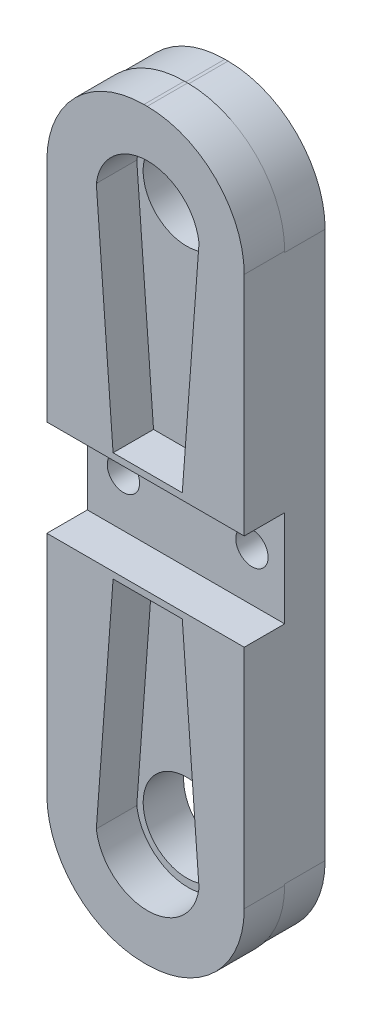
ISO-10303-21;
HEADER;
FILE_DESCRIPTION(('STEP AP214'),'2;1');
FILE_NAME('part.step','',(''),(''),'','','');
FILE_SCHEMA(('AUTOMOTIVE_DESIGN { 1 0 10303 214 1 1 1 1 }'));
ENDSEC;
DATA;
#1=APPLICATION_CONTEXT('core data for automotive mechanical design processes');
#2=APPLICATION_PROTOCOL_DEFINITION('international standard','automotive_design',2000,#1);
#3=PRODUCT_CONTEXT('',#1,'mechanical');
#4=PRODUCT('Part','Part','',(#3));
#5=PRODUCT_RELATED_PRODUCT_CATEGORY('part','',(#4));
#6=PRODUCT_DEFINITION_FORMATION('','',#4);
#7=PRODUCT_DEFINITION_CONTEXT('part definition',#1,'design');
#8=PRODUCT_DEFINITION('design','',#6,#7);
#9=PRODUCT_DEFINITION_SHAPE('','',#8);
#10=(LENGTH_UNIT() NAMED_UNIT(*) SI_UNIT(.MILLI.,.METRE.));
#11=(NAMED_UNIT(*) PLANE_ANGLE_UNIT() SI_UNIT($,.RADIAN.));
#12=(NAMED_UNIT(*) SI_UNIT($,.STERADIAN.) SOLID_ANGLE_UNIT());
#13=UNCERTAINTY_MEASURE_WITH_UNIT(LENGTH_MEASURE(1.E-05),#10,'distance_accuracy_value','');
#14=(GEOMETRIC_REPRESENTATION_CONTEXT(3) GLOBAL_UNCERTAINTY_ASSIGNED_CONTEXT((#13)) GLOBAL_UNIT_ASSIGNED_CONTEXT((#10,
#11,#12)) REPRESENTATION_CONTEXT('',''));
#15=CARTESIAN_POINT('',(0.,0.,0.));
#16=DIRECTION('',(0.,0.,1.));
#17=DIRECTION('',(1.,0.,0.));
#18=AXIS2_PLACEMENT_3D('',#15,#16,#17);
#19=CARTESIAN_POINT('',(0.,0.,12.5));
#20=DIRECTION('',(0.,0.,1.));
#21=DIRECTION('',(1.,0.,0.));
#22=AXIS2_PLACEMENT_3D('',#19,#20,#21);
#23=PLANE('',#22);
#24=CARTESIAN_POINT('',(-185.999682024194,160.057912714201,12.5));
#25=DIRECTION('',(0.,0.,1.));
#26=DIRECTION('',(1.,0.,0.));
#27=AXIS2_PLACEMENT_3D('',#24,#25,#26);
#28=CIRCLE('',#27,1.00000000000002);
#29=CARTESIAN_POINT('',(-184.999682024194,160.057912714201,12.5));
#30=VERTEX_POINT('',#29);
#31=EDGE_CURVE('E326',#30,#30,#28,.T.);
#32=ORIENTED_EDGE('',*,*,#31,.F.);
#33=EDGE_LOOP('',(#32));
#34=FACE_BOUND('',#33,.T.);
#35=CARTESIAN_POINT('',(-178.054871455837,160.057912714201,12.5));
#36=DIRECTION('',(0.,0.,1.));
#37=DIRECTION('',(1.,0.,0.));
#38=AXIS2_PLACEMENT_3D('',#35,#36,#37);
#39=CIRCLE('',#38,0.999999999999998);
#40=CARTESIAN_POINT('',(-177.054871455837,160.057912714201,12.5));
#41=VERTEX_POINT('',#40);
#42=EDGE_CURVE('E273',#41,#41,#39,.T.);
#43=ORIENTED_EDGE('',*,*,#42,.F.);
#44=EDGE_LOOP('',(#43));
#45=FACE_BOUND('',#44,.T.);
#46=DIRECTION('',(0.,-1.,0.));
#47=VECTOR('',#46,1.);
#48=CARTESIAN_POINT('',(-188.231179690793,182.888166790523,12.5));
#49=LINE('',#48,#47);
#50=CARTESIAN_POINT('',(-188.231179690793,162.965455297448,12.5));
#51=VERTEX_POINT('',#50);
#52=CARTESIAN_POINT('',(-188.231179690793,157.010878283599,12.5));
#53=VERTEX_POINT('',#52);
#54=EDGE_CURVE('E411',#51,#53,#49,.T.);
#55=ORIENTED_EDGE('',*,*,#54,.T.);
#56=DIRECTION('',(-1.,0.,0.));
#57=VECTOR('',#56,1.);
#58=CARTESIAN_POINT('',(-176.031179690793,157.010878283599,12.5));
#59=LINE('',#58,#57);
#60=CARTESIAN_POINT('',(-176.031179690793,157.010878283599,12.5));
#61=VERTEX_POINT('',#60);
#62=EDGE_CURVE('E355',#61,#53,#59,.T.);
#63=ORIENTED_EDGE('',*,*,#62,.F.);
#64=DIRECTION('',(0.,1.,0.));
#65=VECTOR('',#64,1.);
#66=CARTESIAN_POINT('',(-176.031179690793,182.888166790523,12.5));
#67=LINE('',#66,#65);
#68=CARTESIAN_POINT('',(-176.031179690793,162.965455297448,12.5));
#69=VERTEX_POINT('',#68);
#70=EDGE_CURVE('E419',#61,#69,#67,.T.);
#71=ORIENTED_EDGE('',*,*,#70,.T.);
#72=DIRECTION('',(1.,0.,0.));
#73=VECTOR('',#72,1.);
#74=CARTESIAN_POINT('',(-176.031179690793,162.965455297448,12.5));
#75=LINE('',#74,#73);
#76=EDGE_CURVE('E379',#51,#69,#75,.T.);
#77=ORIENTED_EDGE('',*,*,#76,.F.);
#78=EDGE_LOOP('',(#55,#63,#71,#77));
#79=FACE_BOUND('',#78,.T.);
#80=ADVANCED_FACE('F39',(#34,#45,#79),#23,.T.);
#81=CARTESIAN_POINT('',(-188.231179690793,182.888166790523,12.5));
#82=DIRECTION('',(1.,0.,0.));
#83=DIRECTION('',(0.,0.,-1.));
#84=AXIS2_PLACEMENT_3D('',#81,#82,#83);
#85=PLANE('',#84);
#86=DIRECTION('',(0.,-1.,0.));
#87=VECTOR('',#86,1.);
#88=CARTESIAN_POINT('',(-188.231179690793,157.010878283599,12.5));
#89=LINE('',#88,#87);
#90=CARTESIAN_POINT('',(-188.231179690793,143.088166790523,12.5));
#91=VERTEX_POINT('',#90);
#92=CARTESIAN_POINT('',(-188.231179690793,143.010878283599,12.5));
#93=VERTEX_POINT('',#92);
#94=EDGE_CURVE('E359',#91,#93,#89,.T.);
#95=ORIENTED_EDGE('',*,*,#94,.T.);
#96=DIRECTION('',(0.,0.,-1.));
#97=VECTOR('',#96,1.);
#98=CARTESIAN_POINT('',(-188.231179690793,143.010878283599,12.5));
#99=LINE('',#98,#97);
#100=CARTESIAN_POINT('',(-188.231179690793,143.010878283599,15.));
#101=VERTEX_POINT('',#100);
#102=EDGE_CURVE('E513',#93,#101,#99,.F.);
#103=ORIENTED_EDGE('',*,*,#102,.T.);
#104=DIRECTION('',(0.,-1.,0.));
#105=VECTOR('',#104,1.);
#106=CARTESIAN_POINT('',(-188.231179690793,157.010878283599,15.));
#107=LINE('',#106,#105);
#108=CARTESIAN_POINT('',(-188.231179690793,157.010878283599,15.));
#109=VERTEX_POINT('',#108);
#110=EDGE_CURVE('E344',#109,#101,#107,.T.);
#111=ORIENTED_EDGE('',*,*,#110,.F.);
#112=DIRECTION('',(0.,0.,-1.));
#113=VECTOR('',#112,1.);
#114=CARTESIAN_POINT('',(-188.231179690793,157.010878283599,15.));
#115=LINE('',#114,#113);
#116=EDGE_CURVE('E352',#109,#53,#115,.T.);
#117=ORIENTED_EDGE('',*,*,#116,.T.);
#118=ORIENTED_EDGE('',*,*,#54,.F.);
#119=DIRECTION('',(0.,0.,-1.));
#120=VECTOR('',#119,1.);
#121=CARTESIAN_POINT('',(-188.231179690793,162.965455297448,15.));
#122=LINE('',#121,#120);
#123=CARTESIAN_POINT('',(-188.231179690793,162.965455297448,15.));
#124=VERTEX_POINT('',#123);
#125=EDGE_CURVE('E406',#124,#51,#122,.T.);
#126=ORIENTED_EDGE('',*,*,#125,.F.);
#127=DIRECTION('',(0.,-1.,0.));
#128=VECTOR('',#127,1.);
#129=CARTESIAN_POINT('',(-188.231179690793,162.965455297448,15.));
#130=LINE('',#129,#128);
#131=CARTESIAN_POINT('',(-188.231179690793,176.965455297448,15.));
#132=VERTEX_POINT('',#131);
#133=EDGE_CURVE('E383',#132,#124,#130,.T.);
#134=ORIENTED_EDGE('',*,*,#133,.F.);
#135=DIRECTION('',(0.,0.,-1.));
#136=VECTOR('',#135,1.);
#137=CARTESIAN_POINT('',(-188.231179690793,176.965455297448,12.5));
#138=LINE('',#137,#136);
#139=CARTESIAN_POINT('',(-188.231179690793,176.965455297448,12.5));
#140=VERTEX_POINT('',#139);
#141=EDGE_CURVE('E509',#132,#140,#138,.T.);
#142=ORIENTED_EDGE('',*,*,#141,.T.);
#143=DIRECTION('',(0.,-1.,0.));
#144=VECTOR('',#143,1.);
#145=CARTESIAN_POINT('',(-188.231179690793,162.965455297448,12.5));
#146=LINE('',#145,#144);
#147=CARTESIAN_POINT('',(-188.231179690793,176.888166790523,12.5));
#148=VERTEX_POINT('',#147);
#149=EDGE_CURVE('E397',#140,#148,#146,.T.);
#150=ORIENTED_EDGE('',*,*,#149,.T.);
#151=DIRECTION('',(0.,0.,-1.));
#152=VECTOR('',#151,1.);
#153=CARTESIAN_POINT('',(-188.231179690793,176.888166790523,12.5));
#154=LINE('',#153,#152);
#155=CARTESIAN_POINT('',(-188.231179690793,176.888166790523,10.));
#156=VERTEX_POINT('',#155);
#157=EDGE_CURVE('E482',#148,#156,#154,.T.);
#158=ORIENTED_EDGE('',*,*,#157,.T.);
#159=DIRECTION('',(0.,-1.,0.));
#160=VECTOR('',#159,1.);
#161=CARTESIAN_POINT('',(-188.231179690793,182.888166790523,10.));
#162=LINE('',#161,#160);
#163=CARTESIAN_POINT('',(-188.231179690793,143.088166790523,10.));
#164=VERTEX_POINT('',#163);
#165=EDGE_CURVE('E410',#156,#164,#162,.T.);
#166=ORIENTED_EDGE('',*,*,#165,.T.);
#167=DIRECTION('',(0.,0.,-1.));
#168=VECTOR('',#167,1.);
#169=CARTESIAN_POINT('',(-188.231179690793,143.088166790523,12.5));
#170=LINE('',#169,#168);
#171=EDGE_CURVE('E486',#164,#91,#170,.F.);
#172=ORIENTED_EDGE('',*,*,#171,.T.);
#173=EDGE_LOOP('',(#95,#103,#111,#117,#118,#126,#134,#142,#150,#158,#166,#172));
#174=FACE_BOUND('',#173,.T.);
#175=ADVANCED_FACE('F578',(#174),#85,.F.);
#176=CARTESIAN_POINT('',(-188.231179690793,137.088166790523,12.5));
#177=DIRECTION('',(0.,1.,0.));
#178=DIRECTION('',(0.,0.,1.));
#179=AXIS2_PLACEMENT_3D('',#176,#177,#178);
#180=PLANE('',#179);
#181=DIRECTION('',(1.,0.,0.));
#182=VECTOR('',#181,1.);
#183=CARTESIAN_POINT('',(-188.231179690793,137.088166790523,10.));
#184=LINE('',#183,#182);
#185=CARTESIAN_POINT('',(-182.231179690793,137.088166790523,10.));
#186=VERTEX_POINT('',#185);
#187=CARTESIAN_POINT('',(-182.031179690793,137.088166790523,10.));
#188=VERTEX_POINT('',#187);
#189=EDGE_CURVE('E430',#186,#188,#184,.T.);
#190=ORIENTED_EDGE('',*,*,#189,.T.);
#191=DIRECTION('',(0.,0.,-1.));
#192=VECTOR('',#191,1.);
#193=CARTESIAN_POINT('',(-182.031179690793,137.088166790523,12.5));
#194=LINE('',#193,#192);
#195=CARTESIAN_POINT('',(-182.031179690793,137.088166790523,12.5));
#196=VERTEX_POINT('',#195);
#197=EDGE_CURVE('E463',#188,#196,#194,.F.);
#198=ORIENTED_EDGE('',*,*,#197,.T.);
#199=DIRECTION('',(1.,0.,0.));
#200=VECTOR('',#199,1.);
#201=CARTESIAN_POINT('',(-188.231179690793,137.088166790523,12.5));
#202=LINE('',#201,#200);
#203=CARTESIAN_POINT('',(-182.231179690793,137.088166790523,12.5));
#204=VERTEX_POINT('',#203);
#205=EDGE_CURVE('E414',#204,#196,#202,.T.);
#206=ORIENTED_EDGE('',*,*,#205,.F.);
#207=DIRECTION('',(0.,0.,-1.));
#208=VECTOR('',#207,1.);
#209=CARTESIAN_POINT('',(-182.231179690793,137.088166790523,12.5));
#210=LINE('',#209,#208);
#211=EDGE_CURVE('E459',#204,#186,#210,.T.);
#212=ORIENTED_EDGE('',*,*,#211,.T.);
#213=EDGE_LOOP('',(#190,#198,#206,#212));
#214=FACE_BOUND('',#213,.T.);
#215=ADVANCED_FACE('F588',(#214),#180,.F.);
#216=CARTESIAN_POINT('',(-176.031179690793,182.888166790523,12.5));
#217=DIRECTION('',(-1.,0.,0.));
#218=DIRECTION('',(0.,0.,1.));
#219=AXIS2_PLACEMENT_3D('',#216,#217,#218);
#220=PLANE('',#219);
#221=DIRECTION('',(0.,1.,0.));
#222=VECTOR('',#221,1.);
#223=CARTESIAN_POINT('',(-176.031179690793,157.010878283599,15.));
#224=LINE('',#223,#222);
#225=CARTESIAN_POINT('',(-176.031179690793,143.010878283599,15.));
#226=VERTEX_POINT('',#225);
#227=CARTESIAN_POINT('',(-176.031179690793,157.010878283599,15.));
#228=VERTEX_POINT('',#227);
#229=EDGE_CURVE('E337',#226,#228,#224,.T.);
#230=ORIENTED_EDGE('',*,*,#229,.F.);
#231=DIRECTION('',(0.,0.,-1.));
#232=VECTOR('',#231,1.);
#233=CARTESIAN_POINT('',(-176.031179690793,143.010878283599,12.5));
#234=LINE('',#233,#232);
#235=CARTESIAN_POINT('',(-176.031179690793,143.010878283599,12.5));
#236=VERTEX_POINT('',#235);
#237=EDGE_CURVE('E525',#226,#236,#234,.T.);
#238=ORIENTED_EDGE('',*,*,#237,.T.);
#239=DIRECTION('',(0.,1.,0.));
#240=VECTOR('',#239,1.);
#241=CARTESIAN_POINT('',(-176.031179690793,157.010878283599,12.5));
#242=LINE('',#241,#240);
#243=CARTESIAN_POINT('',(-176.031179690793,143.088166790523,12.5));
#244=VERTEX_POINT('',#243);
#245=EDGE_CURVE('E325',#236,#244,#242,.T.);
#246=ORIENTED_EDGE('',*,*,#245,.T.);
#247=DIRECTION('',(0.,0.,-1.));
#248=VECTOR('',#247,1.);
#249=CARTESIAN_POINT('',(-176.031179690793,143.088166790523,12.5));
#250=LINE('',#249,#248);
#251=CARTESIAN_POINT('',(-176.031179690793,143.088166790523,10.));
#252=VERTEX_POINT('',#251);
#253=EDGE_CURVE('E443',#244,#252,#250,.T.);
#254=ORIENTED_EDGE('',*,*,#253,.T.);
#255=DIRECTION('',(0.,1.,0.));
#256=VECTOR('',#255,1.);
#257=CARTESIAN_POINT('',(-176.031179690793,182.888166790523,10.));
#258=LINE('',#257,#256);
#259=CARTESIAN_POINT('',(-176.031179690793,176.888166790523,10.));
#260=VERTEX_POINT('',#259);
#261=EDGE_CURVE('E434',#252,#260,#258,.T.);
#262=ORIENTED_EDGE('',*,*,#261,.T.);
#263=DIRECTION('',(0.,0.,-1.));
#264=VECTOR('',#263,1.);
#265=CARTESIAN_POINT('',(-176.031179690793,176.888166790523,12.5));
#266=LINE('',#265,#264);
#267=CARTESIAN_POINT('',(-176.031179690793,176.888166790523,12.5));
#268=VERTEX_POINT('',#267);
#269=EDGE_CURVE('E426',#260,#268,#266,.F.);
#270=ORIENTED_EDGE('',*,*,#269,.T.);
#271=DIRECTION('',(0.,1.,0.));
#272=VECTOR('',#271,1.);
#273=CARTESIAN_POINT('',(-176.031179690793,162.965455297448,12.5));
#274=LINE('',#273,#272);
#275=CARTESIAN_POINT('',(-176.031179690793,176.965455297448,12.5));
#276=VERTEX_POINT('',#275);
#277=EDGE_CURVE('E373',#268,#276,#274,.T.);
#278=ORIENTED_EDGE('',*,*,#277,.T.);
#279=DIRECTION('',(0.,0.,-1.));
#280=VECTOR('',#279,1.);
#281=CARTESIAN_POINT('',(-176.031179690793,176.965455297448,12.5));
#282=LINE('',#281,#280);
#283=CARTESIAN_POINT('',(-176.031179690793,176.965455297448,15.));
#284=VERTEX_POINT('',#283);
#285=EDGE_CURVE('E522',#276,#284,#282,.F.);
#286=ORIENTED_EDGE('',*,*,#285,.T.);
#287=DIRECTION('',(0.,1.,0.));
#288=VECTOR('',#287,1.);
#289=CARTESIAN_POINT('',(-176.031179690793,162.965455297448,15.));
#290=LINE('',#289,#288);
#291=CARTESIAN_POINT('',(-176.031179690793,162.965455297448,15.));
#292=VERTEX_POINT('',#291);
#293=EDGE_CURVE('E374',#292,#284,#290,.T.);
#294=ORIENTED_EDGE('',*,*,#293,.F.);
#295=DIRECTION('',(0.,0.,-1.));
#296=VECTOR('',#295,1.);
#297=CARTESIAN_POINT('',(-176.031179690793,162.965455297448,15.));
#298=LINE('',#297,#296);
#299=EDGE_CURVE('E389',#292,#69,#298,.T.);
#300=ORIENTED_EDGE('',*,*,#299,.T.);
#301=ORIENTED_EDGE('',*,*,#70,.F.);
#302=DIRECTION('',(0.,0.,-1.));
#303=VECTOR('',#302,1.);
#304=CARTESIAN_POINT('',(-176.031179690793,157.010878283599,15.));
#305=LINE('',#304,#303);
#306=EDGE_CURVE('E369',#228,#61,#305,.T.);
#307=ORIENTED_EDGE('',*,*,#306,.F.);
#308=EDGE_LOOP('',(#230,#238,#246,#254,#262,#270,#278,#286,#294,#300,#301,#307));
#309=FACE_BOUND('',#308,.T.);
#310=ADVANCED_FACE('F561',(#309),#220,.F.);
#311=CARTESIAN_POINT('',(-188.231179690793,182.888166790523,12.5));
#312=DIRECTION('',(0.,-1.,0.));
#313=DIRECTION('',(0.,0.,-1.));
#314=AXIS2_PLACEMENT_3D('',#311,#312,#313);
#315=PLANE('',#314);
#316=DIRECTION('',(-1.,0.,0.));
#317=VECTOR('',#316,1.);
#318=CARTESIAN_POINT('',(-188.231179690793,182.888166790523,12.5));
#319=LINE('',#318,#317);
#320=CARTESIAN_POINT('',(-182.031179690793,182.888166790523,12.5));
#321=VERTEX_POINT('',#320);
#322=CARTESIAN_POINT('',(-182.231179690793,182.888166790523,12.5));
#323=VERTEX_POINT('',#322);
#324=EDGE_CURVE('E422',#321,#323,#319,.T.);
#325=ORIENTED_EDGE('',*,*,#324,.F.);
#326=DIRECTION('',(0.,0.,-1.));
#327=VECTOR('',#326,1.);
#328=CARTESIAN_POINT('',(-182.031179690793,182.888166790523,12.5));
#329=LINE('',#328,#327);
#330=CARTESIAN_POINT('',(-182.031179690793,182.888166790523,10.));
#331=VERTEX_POINT('',#330);
#332=EDGE_CURVE('E492',#321,#331,#329,.T.);
#333=ORIENTED_EDGE('',*,*,#332,.T.);
#334=DIRECTION('',(-1.,0.,0.));
#335=VECTOR('',#334,1.);
#336=CARTESIAN_POINT('',(-188.231179690793,182.888166790523,10.));
#337=LINE('',#336,#335);
#338=CARTESIAN_POINT('',(-182.231179690793,182.888166790523,10.));
#339=VERTEX_POINT('',#338);
#340=EDGE_CURVE('E415',#331,#339,#337,.T.);
#341=ORIENTED_EDGE('',*,*,#340,.T.);
#342=DIRECTION('',(0.,0.,-1.));
#343=VECTOR('',#342,1.);
#344=CARTESIAN_POINT('',(-182.231179690793,182.888166790523,12.5));
#345=LINE('',#344,#343);
#346=EDGE_CURVE('E489',#339,#323,#345,.F.);
#347=ORIENTED_EDGE('',*,*,#346,.T.);
#348=EDGE_LOOP('',(#325,#333,#341,#347));
#349=FACE_BOUND('',#348,.T.);
#350=ADVANCED_FACE('F570',(#349),#315,.F.);
#351=CARTESIAN_POINT('',(0.,0.,10.));
#352=DIRECTION('',(0.,0.,1.));
#353=DIRECTION('',(1.,0.,0.));
#354=AXIS2_PLACEMENT_3D('',#351,#352,#353);
#355=PLANE('',#354);
#356=CARTESIAN_POINT('',(-182.080577921619,176.900168290309,10.));
#357=DIRECTION('',(0.,0.,1.));
#358=DIRECTION('',(1.,0.,0.));
#359=AXIS2_PLACEMENT_3D('',#356,#357,#358);
#360=CIRCLE('',#359,2.70000000000001);
#361=CARTESIAN_POINT('',(-179.380577921619,176.900168290309,10.));
#362=VERTEX_POINT('',#361);
#363=EDGE_CURVE('E300',#362,#362,#360,.T.);
#364=ORIENTED_EDGE('',*,*,#363,.T.);
#365=EDGE_LOOP('',(#364));
#366=FACE_BOUND('',#365,.T.);
#367=CARTESIAN_POINT('',(-182.080577921619,143.076165290738,10.));
#368=DIRECTION('',(0.,0.,1.));
#369=DIRECTION('',(-1.,0.,0.));
#370=AXIS2_PLACEMENT_3D('',#367,#368,#369);
#371=CIRCLE('',#370,2.70000000000001);
#372=CARTESIAN_POINT('',(-184.780577921619,143.076165290738,10.));
#373=VERTEX_POINT('',#372);
#374=EDGE_CURVE('E955',#373,#373,#371,.T.);
#375=ORIENTED_EDGE('',*,*,#374,.T.);
#376=EDGE_LOOP('',(#375));
#377=FACE_BOUND('',#376,.T.);
#378=CARTESIAN_POINT('',(-185.999682024194,160.057912714201,10.));
#379=DIRECTION('',(0.,0.,1.));
#380=DIRECTION('',(1.,0.,0.));
#381=AXIS2_PLACEMENT_3D('',#378,#379,#380);
#382=CIRCLE('',#381,1.00000000000002);
#383=CARTESIAN_POINT('',(-184.999682024194,160.057912714201,10.));
#384=VERTEX_POINT('',#383);
#385=EDGE_CURVE('E321',#384,#384,#382,.T.);
#386=ORIENTED_EDGE('',*,*,#385,.T.);
#387=EDGE_LOOP('',(#386));
#388=FACE_BOUND('',#387,.T.);
#389=CARTESIAN_POINT('',(-178.054871455837,160.057912714201,10.));
#390=DIRECTION('',(0.,0.,1.));
#391=DIRECTION('',(1.,0.,0.));
#392=AXIS2_PLACEMENT_3D('',#389,#390,#391);
#393=CIRCLE('',#392,0.999999999999998);
#394=CARTESIAN_POINT('',(-177.054871455837,160.057912714201,10.));
#395=VERTEX_POINT('',#394);
#396=EDGE_CURVE('E330',#395,#395,#393,.T.);
#397=ORIENTED_EDGE('',*,*,#396,.T.);
#398=EDGE_LOOP('',(#397));
#399=FACE_BOUND('',#398,.T.);
#400=ORIENTED_EDGE('',*,*,#261,.F.);
#401=CARTESIAN_POINT('',(-182.031179690793,143.088166790523,10.));
#402=DIRECTION('',(0.,0.,1.));
#403=DIRECTION('',(1.,0.,0.));
#404=AXIS2_PLACEMENT_3D('',#401,#402,#403);
#405=CIRCLE('',#404,6.);
#406=EDGE_CURVE('E456',#252,#188,#405,.F.);
#407=ORIENTED_EDGE('',*,*,#406,.T.);
#408=ORIENTED_EDGE('',*,*,#189,.F.);
#409=CARTESIAN_POINT('',(-182.231179690793,143.088166790523,10.));
#410=DIRECTION('',(0.,0.,1.));
#411=DIRECTION('',(1.,0.,0.));
#412=AXIS2_PLACEMENT_3D('',#409,#410,#411);
#413=CIRCLE('',#412,6.);
#414=EDGE_CURVE('E453',#186,#164,#413,.F.);
#415=ORIENTED_EDGE('',*,*,#414,.T.);
#416=ORIENTED_EDGE('',*,*,#165,.F.);
#417=CARTESIAN_POINT('',(-182.231179690793,176.888166790523,10.));
#418=DIRECTION('',(0.,0.,1.));
#419=DIRECTION('',(1.,0.,0.));
#420=AXIS2_PLACEMENT_3D('',#417,#418,#419);
#421=CIRCLE('',#420,6.);
#422=EDGE_CURVE('E447',#156,#339,#421,.F.);
#423=ORIENTED_EDGE('',*,*,#422,.T.);
#424=ORIENTED_EDGE('',*,*,#340,.F.);
#425=CARTESIAN_POINT('',(-182.031179690793,176.888166790523,10.));
#426=DIRECTION('',(0.,0.,1.));
#427=DIRECTION('',(1.,0.,0.));
#428=AXIS2_PLACEMENT_3D('',#425,#426,#427);
#429=CIRCLE('',#428,6.);
#430=EDGE_CURVE('E450',#331,#260,#429,.F.);
#431=ORIENTED_EDGE('',*,*,#430,.T.);
#432=EDGE_LOOP('',(#400,#407,#408,#415,#416,#423,#424,#431));
#433=FACE_BOUND('',#432,.T.);
#434=ADVANCED_FACE('F581',(#366,#377,#388,#399,#433),#355,.F.);
#435=CARTESIAN_POINT('',(-182.031179690793,143.088166790523,12.5));
#436=DIRECTION('',(0.,0.,-1.));
#437=DIRECTION('',(-1.,0.,0.));
#438=AXIS2_PLACEMENT_3D('',#435,#436,#437);
#439=CYLINDRICAL_SURFACE('',#438,6.);
#440=CARTESIAN_POINT('',(-182.031179690793,143.088166790523,12.5));
#441=DIRECTION('',(0.,0.,1.));
#442=DIRECTION('',(1.,0.,0.));
#443=AXIS2_PLACEMENT_3D('',#440,#441,#442);
#444=CIRCLE('',#443,6.);
#445=EDGE_CURVE('E478',#196,#244,#444,.T.);
#446=ORIENTED_EDGE('',*,*,#445,.F.);
#447=ORIENTED_EDGE('',*,*,#197,.F.);
#448=ORIENTED_EDGE('',*,*,#406,.F.);
#449=ORIENTED_EDGE('',*,*,#253,.F.);
#450=EDGE_LOOP('',(#446,#447,#448,#449));
#451=FACE_BOUND('',#450,.T.);
#452=ADVANCED_FACE('F652',(#451),#439,.T.);
#453=CARTESIAN_POINT('',(-182.231179690793,143.088166790523,12.5));
#454=DIRECTION('',(0.,0.,-1.));
#455=DIRECTION('',(-1.,0.,0.));
#456=AXIS2_PLACEMENT_3D('',#453,#454,#455);
#457=CYLINDRICAL_SURFACE('',#456,6.);
#458=CARTESIAN_POINT('',(-182.231179690793,143.088166790523,12.5));
#459=DIRECTION('',(0.,0.,1.));
#460=DIRECTION('',(1.,0.,0.));
#461=AXIS2_PLACEMENT_3D('',#458,#459,#460);
#462=CIRCLE('',#461,6.);
#463=EDGE_CURVE('E474',#91,#204,#462,.T.);
#464=ORIENTED_EDGE('',*,*,#463,.F.);
#465=ORIENTED_EDGE('',*,*,#171,.F.);
#466=ORIENTED_EDGE('',*,*,#414,.F.);
#467=ORIENTED_EDGE('',*,*,#211,.F.);
#468=EDGE_LOOP('',(#464,#465,#466,#467));
#469=FACE_BOUND('',#468,.T.);
#470=ADVANCED_FACE('F585',(#469),#457,.T.);
#471=CARTESIAN_POINT('',(-182.031179690793,176.888166790523,12.5));
#472=DIRECTION('',(0.,0.,-1.));
#473=DIRECTION('',(-1.,0.,0.));
#474=AXIS2_PLACEMENT_3D('',#471,#472,#473);
#475=CYLINDRICAL_SURFACE('',#474,6.);
#476=CARTESIAN_POINT('',(-182.031179690793,176.888166790523,12.5));
#477=DIRECTION('',(0.,0.,1.));
#478=DIRECTION('',(1.,0.,0.));
#479=AXIS2_PLACEMENT_3D('',#476,#477,#478);
#480=CIRCLE('',#479,6.);
#481=EDGE_CURVE('E470',#268,#321,#480,.T.);
#482=ORIENTED_EDGE('',*,*,#481,.F.);
#483=ORIENTED_EDGE('',*,*,#269,.F.);
#484=ORIENTED_EDGE('',*,*,#430,.F.);
#485=ORIENTED_EDGE('',*,*,#332,.F.);
#486=EDGE_LOOP('',(#482,#483,#484,#485));
#487=FACE_BOUND('',#486,.T.);
#488=ADVANCED_FACE('F567',(#487),#475,.T.);
#489=CARTESIAN_POINT('',(-182.231179690793,176.888166790523,12.5));
#490=DIRECTION('',(0.,0.,-1.));
#491=DIRECTION('',(-1.,0.,0.));
#492=AXIS2_PLACEMENT_3D('',#489,#490,#491);
#493=CYLINDRICAL_SURFACE('',#492,6.);
#494=CARTESIAN_POINT('',(-182.231179690793,176.888166790523,12.5));
#495=DIRECTION('',(0.,0.,1.));
#496=DIRECTION('',(1.,0.,0.));
#497=AXIS2_PLACEMENT_3D('',#494,#495,#496);
#498=CIRCLE('',#497,6.);
#499=EDGE_CURVE('E466',#323,#148,#498,.T.);
#500=ORIENTED_EDGE('',*,*,#499,.F.);
#501=ORIENTED_EDGE('',*,*,#346,.F.);
#502=ORIENTED_EDGE('',*,*,#422,.F.);
#503=ORIENTED_EDGE('',*,*,#157,.F.);
#504=EDGE_LOOP('',(#500,#501,#502,#503));
#505=FACE_BOUND('',#504,.T.);
#506=ADVANCED_FACE('F575',(#505),#493,.T.);
#507=CARTESIAN_POINT('',(0.,0.,12.5));
#508=DIRECTION('',(0.,0.,1.));
#509=DIRECTION('',(1.,0.,0.));
#510=AXIS2_PLACEMENT_3D('',#507,#508,#509);
#511=PLANE('',#510);
#512=ORIENTED_EDGE('',*,*,#149,.F.);
#513=CARTESIAN_POINT('',(-182.231179690793,176.965455297448,12.5));
#514=DIRECTION('',(0.,0.,1.));
#515=DIRECTION('',(1.,0.,0.));
#516=AXIS2_PLACEMENT_3D('',#513,#514,#515);
#517=CIRCLE('',#516,6.);
#518=CARTESIAN_POINT('',(-182.231179690793,182.965455297448,12.5));
#519=VERTEX_POINT('',#518);
#520=EDGE_CURVE('E532',#140,#519,#517,.F.);
#521=ORIENTED_EDGE('',*,*,#520,.T.);
#522=DIRECTION('',(-1.,0.,0.));
#523=VECTOR('',#522,1.);
#524=CARTESIAN_POINT('',(-176.031179690793,182.965455297448,12.5));
#525=LINE('',#524,#523);
#526=CARTESIAN_POINT('',(-182.031179690793,182.965455297448,12.5));
#527=VERTEX_POINT('',#526);
#528=EDGE_CURVE('E393',#527,#519,#525,.T.);
#529=ORIENTED_EDGE('',*,*,#528,.F.);
#530=CARTESIAN_POINT('',(-182.031179690793,176.965455297448,12.5));
#531=DIRECTION('',(0.,0.,1.));
#532=DIRECTION('',(1.,0.,0.));
#533=AXIS2_PLACEMENT_3D('',#530,#531,#532);
#534=CIRCLE('',#533,6.);
#535=EDGE_CURVE('E529',#527,#276,#534,.F.);
#536=ORIENTED_EDGE('',*,*,#535,.T.);
#537=ORIENTED_EDGE('',*,*,#277,.F.);
#538=ORIENTED_EDGE('',*,*,#481,.T.);
#539=ORIENTED_EDGE('',*,*,#324,.T.);
#540=ORIENTED_EDGE('',*,*,#499,.T.);
#541=EDGE_LOOP('',(#512,#521,#529,#536,#537,#538,#539,#540));
#542=FACE_BOUND('',#541,.T.);
#543=ADVANCED_FACE('F558',(#542),#511,.F.);
#544=CARTESIAN_POINT('',(-176.031179690793,182.965455297448,15.));
#545=DIRECTION('',(0.,-1.,0.));
#546=DIRECTION('',(0.,0.,-1.));
#547=AXIS2_PLACEMENT_3D('',#544,#545,#546);
#548=PLANE('',#547);
#549=ORIENTED_EDGE('',*,*,#528,.T.);
#550=DIRECTION('',(0.,0.,-1.));
#551=VECTOR('',#550,1.);
#552=CARTESIAN_POINT('',(-182.231179690793,182.965455297448,15.));
#553=LINE('',#552,#551);
#554=CARTESIAN_POINT('',(-182.231179690793,182.965455297448,15.));
#555=VERTEX_POINT('',#554);
#556=EDGE_CURVE('E539',#519,#555,#553,.F.);
#557=ORIENTED_EDGE('',*,*,#556,.T.);
#558=DIRECTION('',(-1.,0.,0.));
#559=VECTOR('',#558,1.);
#560=CARTESIAN_POINT('',(-176.031179690793,182.965455297448,15.));
#561=LINE('',#560,#559);
#562=CARTESIAN_POINT('',(-182.031179690793,182.965455297448,15.));
#563=VERTEX_POINT('',#562);
#564=EDGE_CURVE('E378',#563,#555,#561,.T.);
#565=ORIENTED_EDGE('',*,*,#564,.F.);
#566=DIRECTION('',(0.,0.,-1.));
#567=VECTOR('',#566,1.);
#568=CARTESIAN_POINT('',(-182.031179690793,182.965455297448,15.));
#569=LINE('',#568,#567);
#570=EDGE_CURVE('E535',#563,#527,#569,.T.);
#571=ORIENTED_EDGE('',*,*,#570,.T.);
#572=EDGE_LOOP('',(#549,#557,#565,#571));
#573=FACE_BOUND('',#572,.T.);
#574=ADVANCED_FACE('F552',(#573),#548,.F.);
#575=CARTESIAN_POINT('',(-176.031179690793,162.965455297448,15.));
#576=DIRECTION('',(0.,1.,0.));
#577=DIRECTION('',(0.,0.,1.));
#578=AXIS2_PLACEMENT_3D('',#575,#576,#577);
#579=PLANE('',#578);
#580=ORIENTED_EDGE('',*,*,#76,.T.);
#581=ORIENTED_EDGE('',*,*,#299,.F.);
#582=DIRECTION('',(1.,0.,0.));
#583=VECTOR('',#582,1.);
#584=CARTESIAN_POINT('',(-176.031179690793,162.965455297448,15.));
#585=LINE('',#584,#583);
#586=EDGE_CURVE('E386',#124,#292,#585,.T.);
#587=ORIENTED_EDGE('',*,*,#586,.F.);
#588=ORIENTED_EDGE('',*,*,#125,.T.);
#589=EDGE_LOOP('',(#580,#581,#587,#588));
#590=FACE_BOUND('',#589,.T.);
#591=ADVANCED_FACE('F624',(#590),#579,.F.);
#592=CARTESIAN_POINT('',(0.,0.,15.));
#593=DIRECTION('',(0.,0.,1.));
#594=DIRECTION('',(1.,0.,0.));
#595=AXIS2_PLACEMENT_3D('',#592,#593,#594);
#596=PLANE('',#595);
#597=DIRECTION('',(0.074379950661477,-0.997229974950411,0.));
#598=VECTOR('',#597,1.);
#599=CARTESIAN_POINT('',(-184.138427734375,163.365707397461,15.));
#600=LINE('',#599,#598);
#601=CARTESIAN_POINT('',(-185.175109863281,177.264755249023,15.));
#602=VERTEX_POINT('',#601);
#603=CARTESIAN_POINT('',(-184.138427734375,163.365707397461,15.));
#604=VERTEX_POINT('',#603);
#605=EDGE_CURVE('E55',#602,#604,#600,.T.);
#606=ORIENTED_EDGE('',*,*,#605,.F.);
#607=CARTESIAN_POINT('',(-182.,176.858526491128,15.));
#608=DIRECTION('',(0.,0.,1.));
#609=DIRECTION('',(-1.,0.,0.));
#610=AXIS2_PLACEMENT_3D('',#607,#608,#609);
#611=CIRCLE('',#610,3.2009911664431);
#612=CARTESIAN_POINT('',(-178.824890136719,177.264755249023,15.));
#613=VERTEX_POINT('',#612);
#614=EDGE_CURVE('E247',#613,#602,#611,.T.);
#615=ORIENTED_EDGE('',*,*,#614,.F.);
#616=DIRECTION('',(0.074379950661475,0.997229974950411,0.));
#617=VECTOR('',#616,1.);
#618=CARTESIAN_POINT('',(-179.861572265625,163.365707397461,15.));
#619=LINE('',#618,#617);
#620=CARTESIAN_POINT('',(-179.861572265625,163.365707397461,15.));
#621=VERTEX_POINT('',#620);
#622=EDGE_CURVE('E251',#621,#613,#619,.T.);
#623=ORIENTED_EDGE('',*,*,#622,.F.);
#624=DIRECTION('',(1.,0.,0.));
#625=VECTOR('',#624,1.);
#626=CARTESIAN_POINT('',(-184.138427734375,163.365707397461,15.));
#627=LINE('',#626,#625);
#628=EDGE_CURVE('E263',#604,#621,#627,.T.);
#629=ORIENTED_EDGE('',*,*,#628,.F.);
#630=EDGE_LOOP('',(#606,#615,#623,#629));
#631=FACE_BOUND('',#630,.T.);
#632=ORIENTED_EDGE('',*,*,#564,.T.);
#633=CARTESIAN_POINT('',(-182.231179690793,176.965455297448,15.));
#634=DIRECTION('',(0.,0.,1.));
#635=DIRECTION('',(1.,0.,0.));
#636=AXIS2_PLACEMENT_3D('',#633,#634,#635);
#637=CIRCLE('',#636,6.);
#638=EDGE_CURVE('E11',#555,#132,#637,.T.);
#639=ORIENTED_EDGE('',*,*,#638,.T.);
#640=ORIENTED_EDGE('',*,*,#133,.T.);
#641=ORIENTED_EDGE('',*,*,#586,.T.);
#642=ORIENTED_EDGE('',*,*,#293,.T.);
#643=CARTESIAN_POINT('',(-182.031179690793,176.965455297448,15.));
#644=DIRECTION('',(0.,0.,1.));
#645=DIRECTION('',(1.,0.,0.));
#646=AXIS2_PLACEMENT_3D('',#643,#644,#645);
#647=CIRCLE('',#646,6.);
#648=EDGE_CURVE('E48',#284,#563,#647,.T.);
#649=ORIENTED_EDGE('',*,*,#648,.T.);
#650=EDGE_LOOP('',(#632,#639,#640,#641,#642,#649));
#651=FACE_BOUND('',#650,.T.);
#652=ADVANCED_FACE('F545',(#631,#651),#596,.T.);
#653=CARTESIAN_POINT('',(-176.031179690793,157.010878283599,15.));
#654=DIRECTION('',(0.,-1.,0.));
#655=DIRECTION('',(0.,0.,-1.));
#656=AXIS2_PLACEMENT_3D('',#653,#654,#655);
#657=PLANE('',#656);
#658=ORIENTED_EDGE('',*,*,#62,.T.);
#659=ORIENTED_EDGE('',*,*,#116,.F.);
#660=DIRECTION('',(-1.,0.,0.));
#661=VECTOR('',#660,1.);
#662=CARTESIAN_POINT('',(-176.031179690793,157.010878283599,15.));
#663=LINE('',#662,#661);
#664=EDGE_CURVE('E340',#228,#109,#663,.T.);
#665=ORIENTED_EDGE('',*,*,#664,.F.);
#666=ORIENTED_EDGE('',*,*,#306,.T.);
#667=EDGE_LOOP('',(#658,#659,#665,#666));
#668=FACE_BOUND('',#667,.T.);
#669=ADVANCED_FACE('F616',(#668),#657,.F.);
#670=CARTESIAN_POINT('',(-176.031179690793,137.010878283599,15.));
#671=DIRECTION('',(0.,1.,0.));
#672=DIRECTION('',(0.,0.,1.));
#673=AXIS2_PLACEMENT_3D('',#670,#671,#672);
#674=PLANE('',#673);
#675=DIRECTION('',(1.,0.,0.));
#676=VECTOR('',#675,1.);
#677=CARTESIAN_POINT('',(-176.031179690793,137.010878283599,15.));
#678=LINE('',#677,#676);
#679=CARTESIAN_POINT('',(-182.231179690793,137.010878283599,15.));
#680=VERTEX_POINT('',#679);
#681=CARTESIAN_POINT('',(-182.031179690793,137.010878283599,15.));
#682=VERTEX_POINT('',#681);
#683=EDGE_CURVE('E348',#680,#682,#678,.T.);
#684=ORIENTED_EDGE('',*,*,#683,.F.);
#685=DIRECTION('',(0.,0.,-1.));
#686=VECTOR('',#685,1.);
#687=CARTESIAN_POINT('',(-182.231179690793,137.010878283599,15.));
#688=LINE('',#687,#686);
#689=CARTESIAN_POINT('',(-182.231179690793,137.010878283599,12.5));
#690=VERTEX_POINT('',#689);
#691=EDGE_CURVE('E499',#680,#690,#688,.T.);
#692=ORIENTED_EDGE('',*,*,#691,.T.);
#693=DIRECTION('',(1.,0.,0.));
#694=VECTOR('',#693,1.);
#695=CARTESIAN_POINT('',(-176.031179690793,137.010878283599,12.5));
#696=LINE('',#695,#694);
#697=CARTESIAN_POINT('',(-182.031179690793,137.010878283599,12.5));
#698=VERTEX_POINT('',#697);
#699=EDGE_CURVE('E341',#690,#698,#696,.T.);
#700=ORIENTED_EDGE('',*,*,#699,.T.);
#701=DIRECTION('',(0.,0.,-1.));
#702=VECTOR('',#701,1.);
#703=CARTESIAN_POINT('',(-182.031179690793,137.010878283599,15.));
#704=LINE('',#703,#702);
#705=EDGE_CURVE('E496',#698,#682,#704,.F.);
#706=ORIENTED_EDGE('',*,*,#705,.T.);
#707=EDGE_LOOP('',(#684,#692,#700,#706));
#708=FACE_BOUND('',#707,.T.);
#709=ADVANCED_FACE('F606',(#708),#674,.F.);
#710=CARTESIAN_POINT('',(0.,0.,15.));
#711=DIRECTION('',(0.,0.,-1.));
#712=DIRECTION('',(-1.,0.,0.));
#713=AXIS2_PLACEMENT_3D('',#710,#711,#712);
#714=PLANE('',#713);
#715=DIRECTION('',(-0.074379950661477,-0.997229974950411,0.));
#716=VECTOR('',#715,1.);
#717=CARTESIAN_POINT('',(-184.138427734375,156.610626183586,15.));
#718=LINE('',#717,#716);
#719=CARTESIAN_POINT('',(-184.138427734375,156.610626183586,15.));
#720=VERTEX_POINT('',#719);
#721=CARTESIAN_POINT('',(-185.175109863281,142.711578332023,15.));
#722=VERTEX_POINT('',#721);
#723=EDGE_CURVE('E299',#720,#722,#718,.T.);
#724=ORIENTED_EDGE('',*,*,#723,.F.);
#725=DIRECTION('',(-1.,0.,0.));
#726=VECTOR('',#725,1.);
#727=CARTESIAN_POINT('',(-184.138427734375,156.610626183586,15.));
#728=LINE('',#727,#726);
#729=CARTESIAN_POINT('',(-179.861572265625,156.610626183586,15.));
#730=VERTEX_POINT('',#729);
#731=EDGE_CURVE('E63',#730,#720,#728,.T.);
#732=ORIENTED_EDGE('',*,*,#731,.F.);
#733=DIRECTION('',(-0.074379950661475,0.997229974950411,0.));
#734=VECTOR('',#733,1.);
#735=CARTESIAN_POINT('',(-179.861572265625,156.610626183586,15.));
#736=LINE('',#735,#734);
#737=CARTESIAN_POINT('',(-178.824890136719,142.711578332023,15.));
#738=VERTEX_POINT('',#737);
#739=EDGE_CURVE('E284',#738,#730,#736,.T.);
#740=ORIENTED_EDGE('',*,*,#739,.F.);
#741=CARTESIAN_POINT('',(-182.,143.117807089918,15.));
#742=DIRECTION('',(0.,0.,1.));
#743=DIRECTION('',(1.,0.,0.));
#744=AXIS2_PLACEMENT_3D('',#741,#742,#743);
#745=CIRCLE('',#744,3.2009911664431);
#746=EDGE_CURVE('E304',#722,#738,#745,.T.);
#747=ORIENTED_EDGE('',*,*,#746,.F.);
#748=EDGE_LOOP('',(#724,#732,#740,#747));
#749=FACE_BOUND('',#748,.T.);
#750=ORIENTED_EDGE('',*,*,#110,.T.);
#751=CARTESIAN_POINT('',(-182.231179690793,143.010878283599,15.));
#752=DIRECTION('',(0.,0.,-1.));
#753=DIRECTION('',(-1.,0.,0.));
#754=AXIS2_PLACEMENT_3D('',#751,#752,#753);
#755=CIRCLE('',#754,6.);
#756=EDGE_CURVE('E519',#101,#680,#755,.F.);
#757=ORIENTED_EDGE('',*,*,#756,.T.);
#758=ORIENTED_EDGE('',*,*,#683,.T.);
#759=CARTESIAN_POINT('',(-182.031179690793,143.010878283599,15.));
#760=DIRECTION('',(0.,0.,-1.));
#761=DIRECTION('',(-1.,0.,0.));
#762=AXIS2_PLACEMENT_3D('',#759,#760,#761);
#763=CIRCLE('',#762,6.);
#764=EDGE_CURVE('E516',#682,#226,#763,.F.);
#765=ORIENTED_EDGE('',*,*,#764,.T.);
#766=ORIENTED_EDGE('',*,*,#229,.T.);
#767=ORIENTED_EDGE('',*,*,#664,.T.);
#768=EDGE_LOOP('',(#750,#757,#758,#765,#766,#767));
#769=FACE_BOUND('',#768,.T.);
#770=ADVANCED_FACE('F603',(#749,#769),#714,.F.);
#771=CARTESIAN_POINT('',(0.,0.,12.5));
#772=DIRECTION('',(0.,0.,-1.));
#773=DIRECTION('',(-1.,0.,0.));
#774=AXIS2_PLACEMENT_3D('',#771,#772,#773);
#775=PLANE('',#774);
#776=ORIENTED_EDGE('',*,*,#699,.F.);
#777=CARTESIAN_POINT('',(-182.231179690793,143.010878283599,12.5));
#778=DIRECTION('',(0.,0.,-1.));
#779=DIRECTION('',(-1.,0.,0.));
#780=AXIS2_PLACEMENT_3D('',#777,#778,#779);
#781=CIRCLE('',#780,6.);
#782=EDGE_CURVE('E506',#690,#93,#781,.T.);
#783=ORIENTED_EDGE('',*,*,#782,.T.);
#784=ORIENTED_EDGE('',*,*,#94,.F.);
#785=ORIENTED_EDGE('',*,*,#463,.T.);
#786=ORIENTED_EDGE('',*,*,#205,.T.);
#787=ORIENTED_EDGE('',*,*,#445,.T.);
#788=ORIENTED_EDGE('',*,*,#245,.F.);
#789=CARTESIAN_POINT('',(-182.031179690793,143.010878283599,12.5));
#790=DIRECTION('',(0.,0.,-1.));
#791=DIRECTION('',(-1.,0.,0.));
#792=AXIS2_PLACEMENT_3D('',#789,#790,#791);
#793=CIRCLE('',#792,6.);
#794=EDGE_CURVE('E503',#236,#698,#793,.T.);
#795=ORIENTED_EDGE('',*,*,#794,.T.);
#796=EDGE_LOOP('',(#776,#783,#784,#785,#786,#787,#788,#795));
#797=FACE_BOUND('',#796,.T.);
#798=ADVANCED_FACE('F594',(#797),#775,.T.);
#799=CARTESIAN_POINT('',(-182.231179690793,143.010878283599,15.));
#800=DIRECTION('',(0.,0.,-1.));
#801=DIRECTION('',(-1.,0.,0.));
#802=AXIS2_PLACEMENT_3D('',#799,#800,#801);
#803=CYLINDRICAL_SURFACE('',#802,6.);
#804=ORIENTED_EDGE('',*,*,#756,.F.);
#805=ORIENTED_EDGE('',*,*,#102,.F.);
#806=ORIENTED_EDGE('',*,*,#782,.F.);
#807=ORIENTED_EDGE('',*,*,#691,.F.);
#808=EDGE_LOOP('',(#804,#805,#806,#807));
#809=FACE_BOUND('',#808,.T.);
#810=ADVANCED_FACE('F599',(#809),#803,.T.);
#811=CARTESIAN_POINT('',(-182.031179690793,143.010878283599,12.5));
#812=DIRECTION('',(0.,0.,-1.));
#813=DIRECTION('',(-1.,0.,0.));
#814=AXIS2_PLACEMENT_3D('',#811,#812,#813);
#815=CYLINDRICAL_SURFACE('',#814,6.);
#816=ORIENTED_EDGE('',*,*,#764,.F.);
#817=ORIENTED_EDGE('',*,*,#705,.F.);
#818=ORIENTED_EDGE('',*,*,#794,.F.);
#819=ORIENTED_EDGE('',*,*,#237,.F.);
#820=EDGE_LOOP('',(#816,#817,#818,#819));
#821=FACE_BOUND('',#820,.T.);
#822=ADVANCED_FACE('F609',(#821),#815,.T.);
#823=CARTESIAN_POINT('',(-182.231179690793,176.965455297448,12.5));
#824=DIRECTION('',(0.,0.,-1.));
#825=DIRECTION('',(-1.,0.,0.));
#826=AXIS2_PLACEMENT_3D('',#823,#824,#825);
#827=CYLINDRICAL_SURFACE('',#826,6.);
#828=ORIENTED_EDGE('',*,*,#638,.F.);
#829=ORIENTED_EDGE('',*,*,#556,.F.);
#830=ORIENTED_EDGE('',*,*,#520,.F.);
#831=ORIENTED_EDGE('',*,*,#141,.F.);
#832=EDGE_LOOP('',(#828,#829,#830,#831));
#833=FACE_BOUND('',#832,.T.);
#834=ADVANCED_FACE('F628',(#833),#827,.T.);
#835=CARTESIAN_POINT('',(-182.031179690793,176.965455297448,15.));
#836=DIRECTION('',(0.,0.,-1.));
#837=DIRECTION('',(-1.,0.,0.));
#838=AXIS2_PLACEMENT_3D('',#835,#836,#837);
#839=CYLINDRICAL_SURFACE('',#838,6.);
#840=ORIENTED_EDGE('',*,*,#648,.F.);
#841=ORIENTED_EDGE('',*,*,#285,.F.);
#842=ORIENTED_EDGE('',*,*,#535,.F.);
#843=ORIENTED_EDGE('',*,*,#570,.F.);
#844=EDGE_LOOP('',(#840,#841,#842,#843));
#845=FACE_BOUND('',#844,.T.);
#846=ADVANCED_FACE('F41',(#845),#839,.T.);
#847=CARTESIAN_POINT('',(-178.054871455837,160.057912714201,10.));
#848=DIRECTION('',(0.,0.,1.));
#849=DIRECTION('',(1.,0.,0.));
#850=AXIS2_PLACEMENT_3D('',#847,#848,#849);
#851=CYLINDRICAL_SURFACE('',#850,0.999999999999998);
#852=ORIENTED_EDGE('',*,*,#396,.F.);
#853=EDGE_LOOP('',(#852));
#854=FACE_BOUND('',#853,.T.);
#855=ORIENTED_EDGE('',*,*,#42,.T.);
#856=EDGE_LOOP('',(#855));
#857=FACE_BOUND('',#856,.T.);
#858=ADVANCED_FACE('F634',(#854,#857),#851,.F.);
#859=CARTESIAN_POINT('',(-185.999682024194,160.057912714201,10.));
#860=DIRECTION('',(0.,0.,1.));
#861=DIRECTION('',(1.,0.,0.));
#862=AXIS2_PLACEMENT_3D('',#859,#860,#861);
#863=CYLINDRICAL_SURFACE('',#862,1.00000000000002);
#864=ORIENTED_EDGE('',*,*,#385,.F.);
#865=EDGE_LOOP('',(#864));
#866=FACE_BOUND('',#865,.T.);
#867=ORIENTED_EDGE('',*,*,#31,.T.);
#868=EDGE_LOOP('',(#867));
#869=FACE_BOUND('',#868,.T.);
#870=ADVANCED_FACE('F829',(#866,#869),#863,.F.);
#871=CARTESIAN_POINT('',(-184.138427734375,156.610626183586,12.5));
#872=DIRECTION('',(0.,1.,0.));
#873=DIRECTION('',(0.,0.,1.));
#874=AXIS2_PLACEMENT_3D('',#871,#872,#873);
#875=PLANE('',#874);
#876=ORIENTED_EDGE('',*,*,#731,.T.);
#877=DIRECTION('',(0.,0.,1.));
#878=VECTOR('',#877,1.);
#879=CARTESIAN_POINT('',(-184.138427734375,156.610626183586,12.5));
#880=LINE('',#879,#878);
#881=CARTESIAN_POINT('',(-184.138427734375,156.610626183586,12.5));
#882=VERTEX_POINT('',#881);
#883=EDGE_CURVE('E296',#882,#720,#880,.T.);
#884=ORIENTED_EDGE('',*,*,#883,.F.);
#885=DIRECTION('',(-1.,0.,0.));
#886=VECTOR('',#885,1.);
#887=CARTESIAN_POINT('',(-184.138427734375,156.610626183586,12.5));
#888=LINE('',#887,#886);
#889=CARTESIAN_POINT('',(-179.861572265625,156.610626183586,12.5));
#890=VERTEX_POINT('',#889);
#891=EDGE_CURVE('E279',#890,#882,#888,.T.);
#892=ORIENTED_EDGE('',*,*,#891,.F.);
#893=DIRECTION('',(0.,0.,1.));
#894=VECTOR('',#893,1.);
#895=CARTESIAN_POINT('',(-179.861572265625,156.610626183586,12.5));
#896=LINE('',#895,#894);
#897=EDGE_CURVE('E264',#890,#730,#896,.T.);
#898=ORIENTED_EDGE('',*,*,#897,.T.);
#899=EDGE_LOOP('',(#876,#884,#892,#898));
#900=FACE_BOUND('',#899,.T.);
#901=ADVANCED_FACE('F836',(#900),#875,.F.);
#902=CARTESIAN_POINT('',(-179.861572265625,156.610626183586,12.5));
#903=DIRECTION('',(0.99722997495041,0.074379950661475,0.));
#904=DIRECTION('',(-0.074379950661475,0.997229974950411,0.));
#905=AXIS2_PLACEMENT_3D('',#902,#903,#904);
#906=PLANE('',#905);
#907=ORIENTED_EDGE('',*,*,#739,.T.);
#908=ORIENTED_EDGE('',*,*,#897,.F.);
#909=DIRECTION('',(-0.074379950661475,0.997229974950411,0.));
#910=VECTOR('',#909,1.);
#911=CARTESIAN_POINT('',(-179.861572265625,156.610626183586,12.5));
#912=LINE('',#911,#910);
#913=CARTESIAN_POINT('',(-178.824890136719,142.711578332023,12.5));
#914=VERTEX_POINT('',#913);
#915=EDGE_CURVE('E292',#914,#890,#912,.T.);
#916=ORIENTED_EDGE('',*,*,#915,.F.);
#917=DIRECTION('',(0.,0.,1.));
#918=VECTOR('',#917,1.);
#919=CARTESIAN_POINT('',(-178.824890136719,142.711578332023,12.5));
#920=LINE('',#919,#918);
#921=EDGE_CURVE('E313',#914,#738,#920,.T.);
#922=ORIENTED_EDGE('',*,*,#921,.T.);
#923=EDGE_LOOP('',(#907,#908,#916,#922));
#924=FACE_BOUND('',#923,.T.);
#925=ADVANCED_FACE('F844',(#924),#906,.F.);
#926=CARTESIAN_POINT('',(-182.,143.117807089918,12.5));
#927=DIRECTION('',(0.,0.,1.));
#928=DIRECTION('',(1.,0.,0.));
#929=AXIS2_PLACEMENT_3D('',#926,#927,#928);
#930=CYLINDRICAL_SURFACE('',#929,3.2009911664431);
#931=ORIENTED_EDGE('',*,*,#746,.T.);
#932=ORIENTED_EDGE('',*,*,#921,.F.);
#933=CARTESIAN_POINT('',(-182.,143.117807089918,12.5));
#934=DIRECTION('',(0.,0.,1.));
#935=DIRECTION('',(1.,0.,0.));
#936=AXIS2_PLACEMENT_3D('',#933,#934,#935);
#937=CIRCLE('',#936,3.2009911664431);
#938=CARTESIAN_POINT('',(-185.175109863281,142.711578332023,12.5));
#939=VERTEX_POINT('',#938);
#940=EDGE_CURVE('E288',#939,#914,#937,.T.);
#941=ORIENTED_EDGE('',*,*,#940,.F.);
#942=DIRECTION('',(0.,0.,1.));
#943=VECTOR('',#942,1.);
#944=CARTESIAN_POINT('',(-185.175109863281,142.711578332023,12.5));
#945=LINE('',#944,#943);
#946=EDGE_CURVE('E316',#939,#722,#945,.T.);
#947=ORIENTED_EDGE('',*,*,#946,.T.);
#948=EDGE_LOOP('',(#931,#932,#941,#947));
#949=FACE_BOUND('',#948,.T.);
#950=ADVANCED_FACE('F852',(#949),#930,.F.);
#951=CARTESIAN_POINT('',(-184.138427734375,156.610626183586,12.5));
#952=DIRECTION('',(-0.997229974950411,0.074379950661477,0.));
#953=DIRECTION('',(-0.074379950661477,-0.997229974950411,0.));
#954=AXIS2_PLACEMENT_3D('',#951,#952,#953);
#955=PLANE('',#954);
#956=ORIENTED_EDGE('',*,*,#723,.T.);
#957=ORIENTED_EDGE('',*,*,#946,.F.);
#958=DIRECTION('',(-0.074379950661477,-0.997229974950411,0.));
#959=VECTOR('',#958,1.);
#960=CARTESIAN_POINT('',(-184.138427734375,156.610626183586,12.5));
#961=LINE('',#960,#959);
#962=EDGE_CURVE('E283',#882,#939,#961,.T.);
#963=ORIENTED_EDGE('',*,*,#962,.F.);
#964=ORIENTED_EDGE('',*,*,#883,.T.);
#965=EDGE_LOOP('',(#956,#957,#963,#964));
#966=FACE_BOUND('',#965,.T.);
#967=ADVANCED_FACE('F861',(#966),#955,.F.);
#968=CARTESIAN_POINT('',(-182.,143.117807089918,12.5));
#969=DIRECTION('',(0.,0.,1.));
#970=DIRECTION('',(1.,0.,0.));
#971=AXIS2_PLACEMENT_3D('',#968,#969,#970);
#972=PLANE('',#971);
#973=CARTESIAN_POINT('',(-182.080577921619,143.076165290738,12.5));
#974=DIRECTION('',(0.,0.,1.));
#975=DIRECTION('',(-1.,0.,0.));
#976=AXIS2_PLACEMENT_3D('',#973,#974,#975);
#977=CIRCLE('',#976,2.70000000000001);
#978=CARTESIAN_POINT('',(-184.780577921619,143.076165290738,12.5));
#979=VERTEX_POINT('',#978);
#980=EDGE_CURVE('E254',#979,#979,#977,.T.);
#981=ORIENTED_EDGE('',*,*,#980,.F.);
#982=EDGE_LOOP('',(#981));
#983=FACE_BOUND('',#982,.T.);
#984=ORIENTED_EDGE('',*,*,#891,.T.);
#985=ORIENTED_EDGE('',*,*,#962,.T.);
#986=ORIENTED_EDGE('',*,*,#940,.T.);
#987=ORIENTED_EDGE('',*,*,#915,.T.);
#988=EDGE_LOOP('',(#984,#985,#986,#987));
#989=FACE_BOUND('',#988,.T.);
#990=ADVANCED_FACE('F870',(#983,#989),#972,.T.);
#991=CARTESIAN_POINT('',(-184.138427734375,163.365707397461,12.5));
#992=DIRECTION('',(-0.997229974950411,-0.074379950661477,0.));
#993=DIRECTION('',(0.074379950661477,-0.997229974950411,0.));
#994=AXIS2_PLACEMENT_3D('',#991,#992,#993);
#995=PLANE('',#994);
#996=ORIENTED_EDGE('',*,*,#605,.T.);
#997=DIRECTION('',(0.,0.,1.));
#998=VECTOR('',#997,1.);
#999=CARTESIAN_POINT('',(-184.138427734375,163.365707397461,12.5));
#1000=LINE('',#999,#998);
#1001=CARTESIAN_POINT('',(-184.138427734375,163.365707397461,12.5));
#1002=VERTEX_POINT('',#1001);
#1003=EDGE_CURVE('E222',#1002,#604,#1000,.T.);
#1004=ORIENTED_EDGE('',*,*,#1003,.F.);
#1005=DIRECTION('',(0.074379950661477,-0.997229974950411,0.));
#1006=VECTOR('',#1005,1.);
#1007=CARTESIAN_POINT('',(-184.138427734375,163.365707397461,12.5));
#1008=LINE('',#1007,#1006);
#1009=CARTESIAN_POINT('',(-185.175109863281,177.264755249023,12.5));
#1010=VERTEX_POINT('',#1009);
#1011=EDGE_CURVE('E226',#1010,#1002,#1008,.T.);
#1012=ORIENTED_EDGE('',*,*,#1011,.F.);
#1013=DIRECTION('',(0.,0.,1.));
#1014=VECTOR('',#1013,1.);
#1015=CARTESIAN_POINT('',(-185.175109863281,177.264755249023,12.5));
#1016=LINE('',#1015,#1014);
#1017=EDGE_CURVE('E270',#1010,#602,#1016,.T.);
#1018=ORIENTED_EDGE('',*,*,#1017,.T.);
#1019=EDGE_LOOP('',(#996,#1004,#1012,#1018));
#1020=FACE_BOUND('',#1019,.T.);
#1021=ADVANCED_FACE('F224',(#1020),#995,.F.);
#1022=CARTESIAN_POINT('',(-182.,176.858526491128,12.5));
#1023=DIRECTION('',(0.,0.,1.));
#1024=DIRECTION('',(1.,0.,0.));
#1025=AXIS2_PLACEMENT_3D('',#1022,#1023,#1024);
#1026=CYLINDRICAL_SURFACE('',#1025,3.2009911664431);
#1027=ORIENTED_EDGE('',*,*,#614,.T.);
#1028=ORIENTED_EDGE('',*,*,#1017,.F.);
#1029=CARTESIAN_POINT('',(-182.,176.858526491128,12.5));
#1030=DIRECTION('',(0.,0.,1.));
#1031=DIRECTION('',(-1.,0.,0.));
#1032=AXIS2_PLACEMENT_3D('',#1029,#1030,#1031);
#1033=CIRCLE('',#1032,3.2009911664431);
#1034=CARTESIAN_POINT('',(-178.824890136719,177.264755249023,12.5));
#1035=VERTEX_POINT('',#1034);
#1036=EDGE_CURVE('E233',#1035,#1010,#1033,.T.);
#1037=ORIENTED_EDGE('',*,*,#1036,.F.);
#1038=DIRECTION('',(0.,0.,1.));
#1039=VECTOR('',#1038,1.);
#1040=CARTESIAN_POINT('',(-178.824890136719,177.264755249023,12.5));
#1041=LINE('',#1040,#1039);
#1042=EDGE_CURVE('E274',#1035,#613,#1041,.T.);
#1043=ORIENTED_EDGE('',*,*,#1042,.T.);
#1044=EDGE_LOOP('',(#1027,#1028,#1037,#1043));
#1045=FACE_BOUND('',#1044,.T.);
#1046=ADVANCED_FACE('F887',(#1045),#1026,.F.);
#1047=CARTESIAN_POINT('',(-179.861572265625,163.365707397461,12.5));
#1048=DIRECTION('',(0.99722997495041,-0.074379950661475,0.));
#1049=DIRECTION('',(0.074379950661475,0.997229974950411,0.));
#1050=AXIS2_PLACEMENT_3D('',#1047,#1048,#1049);
#1051=PLANE('',#1050);
#1052=ORIENTED_EDGE('',*,*,#622,.T.);
#1053=ORIENTED_EDGE('',*,*,#1042,.F.);
#1054=DIRECTION('',(0.074379950661475,0.997229974950411,0.));
#1055=VECTOR('',#1054,1.);
#1056=CARTESIAN_POINT('',(-179.861572265625,163.365707397461,12.5));
#1057=LINE('',#1056,#1055);
#1058=CARTESIAN_POINT('',(-179.861572265625,163.365707397461,12.5));
#1059=VERTEX_POINT('',#1058);
#1060=EDGE_CURVE('E242',#1059,#1035,#1057,.T.);
#1061=ORIENTED_EDGE('',*,*,#1060,.F.);
#1062=DIRECTION('',(0.,0.,1.));
#1063=VECTOR('',#1062,1.);
#1064=CARTESIAN_POINT('',(-179.861572265625,163.365707397461,12.5));
#1065=LINE('',#1064,#1063);
#1066=EDGE_CURVE('E232',#1059,#621,#1065,.T.);
#1067=ORIENTED_EDGE('',*,*,#1066,.T.);
#1068=EDGE_LOOP('',(#1052,#1053,#1061,#1067));
#1069=FACE_BOUND('',#1068,.T.);
#1070=ADVANCED_FACE('F895',(#1069),#1051,.F.);
#1071=CARTESIAN_POINT('',(-184.138427734375,163.365707397461,12.5));
#1072=DIRECTION('',(0.,-1.,0.));
#1073=DIRECTION('',(0.,0.,-1.));
#1074=AXIS2_PLACEMENT_3D('',#1071,#1072,#1073);
#1075=PLANE('',#1074);
#1076=ORIENTED_EDGE('',*,*,#628,.T.);
#1077=ORIENTED_EDGE('',*,*,#1066,.F.);
#1078=DIRECTION('',(1.,0.,0.));
#1079=VECTOR('',#1078,1.);
#1080=CARTESIAN_POINT('',(-184.138427734375,163.365707397461,12.5));
#1081=LINE('',#1080,#1079);
#1082=EDGE_CURVE('E236',#1002,#1059,#1081,.T.);
#1083=ORIENTED_EDGE('',*,*,#1082,.F.);
#1084=ORIENTED_EDGE('',*,*,#1003,.T.);
#1085=EDGE_LOOP('',(#1076,#1077,#1083,#1084));
#1086=FACE_BOUND('',#1085,.T.);
#1087=ADVANCED_FACE('F237',(#1086),#1075,.F.);
#1088=CARTESIAN_POINT('',(-182.,176.858526491128,12.5));
#1089=DIRECTION('',(0.,0.,-1.));
#1090=DIRECTION('',(-1.,0.,0.));
#1091=AXIS2_PLACEMENT_3D('',#1088,#1089,#1090);
#1092=PLANE('',#1091);
#1093=CARTESIAN_POINT('',(-182.080577921619,176.900168290309,12.5));
#1094=DIRECTION('',(0.,0.,1.));
#1095=DIRECTION('',(1.,0.,0.));
#1096=AXIS2_PLACEMENT_3D('',#1093,#1094,#1095);
#1097=CIRCLE('',#1096,2.70000000000001);
#1098=CARTESIAN_POINT('',(-179.380577921619,176.900168290309,12.5));
#1099=VERTEX_POINT('',#1098);
#1100=EDGE_CURVE('E960',#1099,#1099,#1097,.T.);
#1101=ORIENTED_EDGE('',*,*,#1100,.F.);
#1102=EDGE_LOOP('',(#1101));
#1103=FACE_BOUND('',#1102,.T.);
#1104=ORIENTED_EDGE('',*,*,#1011,.T.);
#1105=ORIENTED_EDGE('',*,*,#1082,.T.);
#1106=ORIENTED_EDGE('',*,*,#1060,.T.);
#1107=ORIENTED_EDGE('',*,*,#1036,.T.);
#1108=EDGE_LOOP('',(#1104,#1105,#1106,#1107));
#1109=FACE_BOUND('',#1108,.T.);
#1110=ADVANCED_FACE('F244',(#1103,#1109),#1092,.F.);
#1111=CARTESIAN_POINT('',(-182.080577921619,176.900168290309,10.));
#1112=DIRECTION('',(0.,0.,1.));
#1113=DIRECTION('',(1.,0.,0.));
#1114=AXIS2_PLACEMENT_3D('',#1111,#1112,#1113);
#1115=CYLINDRICAL_SURFACE('',#1114,2.70000000000001);
#1116=ORIENTED_EDGE('',*,*,#363,.F.);
#1117=EDGE_LOOP('',(#1116));
#1118=FACE_BOUND('',#1117,.T.);
#1119=ORIENTED_EDGE('',*,*,#1100,.T.);
#1120=EDGE_LOOP('',(#1119));
#1121=FACE_BOUND('',#1120,.T.);
#1122=ADVANCED_FACE('F917',(#1118,#1121),#1115,.F.);
#1123=CARTESIAN_POINT('',(-182.080577921619,143.076165290738,10.));
#1124=DIRECTION('',(0.,0.,1.));
#1125=DIRECTION('',(1.,0.,0.));
#1126=AXIS2_PLACEMENT_3D('',#1123,#1124,#1125);
#1127=CYLINDRICAL_SURFACE('',#1126,2.70000000000001);
#1128=ORIENTED_EDGE('',*,*,#374,.F.);
#1129=EDGE_LOOP('',(#1128));
#1130=FACE_BOUND('',#1129,.T.);
#1131=ORIENTED_EDGE('',*,*,#980,.T.);
#1132=EDGE_LOOP('',(#1131));
#1133=FACE_BOUND('',#1132,.T.);
#1134=ADVANCED_FACE('F926',(#1130,#1133),#1127,.F.);
#1135=CLOSED_SHELL('',(#80,#175,#215,#310,#350,#434,#452,#470,#488,#506,#543,#574,#591,#652,
#669,#709,#770,#798,#810,#822,#834,#846,#858,#870,#901,#925,#950,#967,#990,#1021,#1046,#1070,
#1087,#1110,#1122,#1134));
#1136=MANIFOLD_SOLID_BREP('B2',#1135);
#1137=ADVANCED_BREP_SHAPE_REPRESENTATION('',(#18,#1136),#14);
#1138=SHAPE_DEFINITION_REPRESENTATION(#9,#1137);
ENDSEC;
END-ISO-10303-21;
